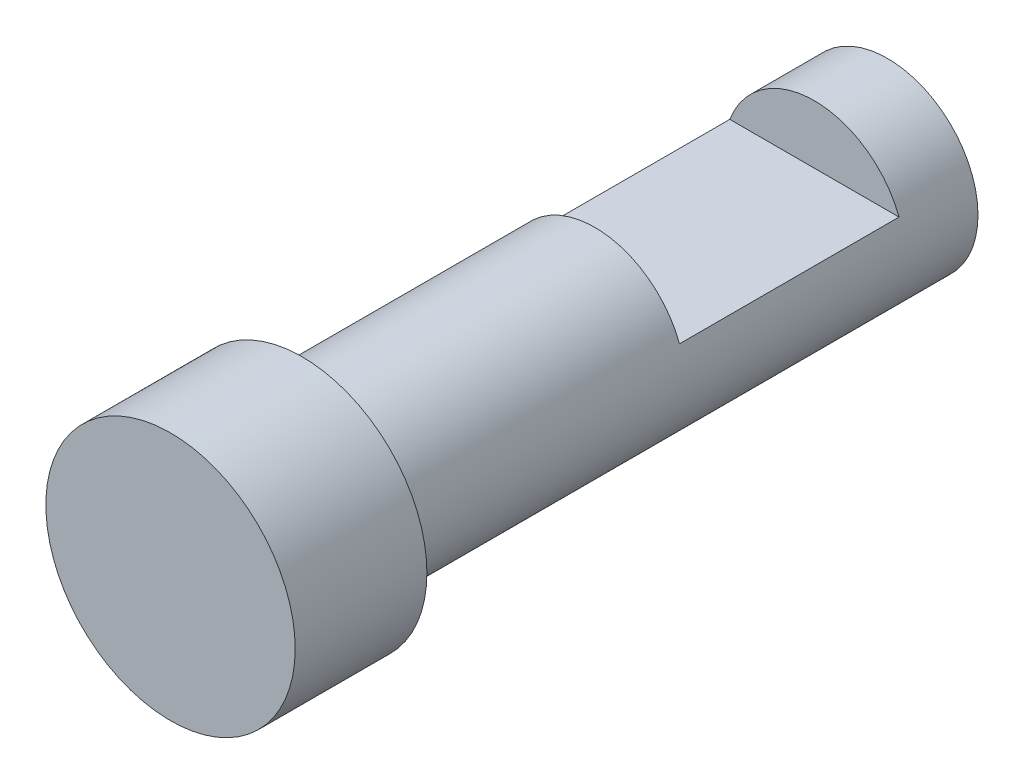
ISO-10303-21;
HEADER;
FILE_DESCRIPTION(('STEP AP214'),'2;1');
FILE_NAME('part.step','',(''),(''),'','','');
FILE_SCHEMA(('AUTOMOTIVE_DESIGN { 1 0 10303 214 1 1 1 1 }'));
ENDSEC;
DATA;
#1=APPLICATION_CONTEXT('core data for automotive mechanical design processes');
#2=APPLICATION_PROTOCOL_DEFINITION('international standard','automotive_design',2000,#1);
#3=PRODUCT_CONTEXT('',#1,'mechanical');
#4=PRODUCT('Part','Part','',(#3));
#5=PRODUCT_RELATED_PRODUCT_CATEGORY('part','',(#4));
#6=PRODUCT_DEFINITION_FORMATION('','',#4);
#7=PRODUCT_DEFINITION_CONTEXT('part definition',#1,'design');
#8=PRODUCT_DEFINITION('design','',#6,#7);
#9=PRODUCT_DEFINITION_SHAPE('','',#8);
#10=(LENGTH_UNIT() NAMED_UNIT(*) SI_UNIT(.MILLI.,.METRE.));
#11=(NAMED_UNIT(*) PLANE_ANGLE_UNIT() SI_UNIT($,.RADIAN.));
#12=(NAMED_UNIT(*) SI_UNIT($,.STERADIAN.) SOLID_ANGLE_UNIT());
#13=UNCERTAINTY_MEASURE_WITH_UNIT(LENGTH_MEASURE(1.E-05),#10,'distance_accuracy_value','');
#14=(GEOMETRIC_REPRESENTATION_CONTEXT(3) GLOBAL_UNCERTAINTY_ASSIGNED_CONTEXT((#13)) GLOBAL_UNIT_ASSIGNED_CONTEXT((#10,
#11,#12)) REPRESENTATION_CONTEXT('',''));
#15=CARTESIAN_POINT('',(0.,0.,0.));
#16=DIRECTION('',(0.,0.,1.));
#17=DIRECTION('',(1.,0.,0.));
#18=AXIS2_PLACEMENT_3D('',#15,#16,#17);
#19=CARTESIAN_POINT('',(0.,0.,0.));
#20=DIRECTION('',(0.,0.,1.));
#21=DIRECTION('',(1.,0.,0.));
#22=AXIS2_PLACEMENT_3D('',#19,#20,#21);
#23=PLANE('',#22);
#24=CARTESIAN_POINT('',(0.,0.,0.));
#25=DIRECTION('',(0.,0.,1.));
#26=DIRECTION('',(1.,0.,0.));
#27=AXIS2_PLACEMENT_3D('',#24,#25,#26);
#28=CIRCLE('',#27,5.4102);
#29=CARTESIAN_POINT('',(5.4102,0.,0.));
#30=VERTEX_POINT('',#29);
#31=EDGE_CURVE('E81',#30,#30,#28,.T.);
#32=ORIENTED_EDGE('',*,*,#31,.F.);
#33=EDGE_LOOP('',(#32));
#34=FACE_BOUND('',#33,.T.);
#35=CARTESIAN_POINT('',(0.,0.,0.));
#36=DIRECTION('',(0.,0.,1.));
#37=DIRECTION('',(1.,0.,0.));
#38=AXIS2_PLACEMENT_3D('',#35,#36,#37);
#39=CIRCLE('',#38,3.9243);
#40=CARTESIAN_POINT('',(3.9243,0.,0.));
#41=VERTEX_POINT('',#40);
#42=EDGE_CURVE('E75',#41,#41,#39,.F.);
#43=ORIENTED_EDGE('',*,*,#42,.F.);
#44=EDGE_LOOP('',(#43));
#45=FACE_BOUND('',#44,.T.);
#46=ADVANCED_FACE('F35',(#34,#45),#23,.F.);
#47=CARTESIAN_POINT('',(0.,0.,5.715));
#48=DIRECTION('',(0.,0.,-1.));
#49=DIRECTION('',(-1.,0.,0.));
#50=AXIS2_PLACEMENT_3D('',#47,#48,#49);
#51=CYLINDRICAL_SURFACE('',#50,5.4102);
#52=CARTESIAN_POINT('',(0.,0.,5.715));
#53=DIRECTION('',(0.,0.,1.));
#54=DIRECTION('',(1.,0.,0.));
#55=AXIS2_PLACEMENT_3D('',#52,#53,#54);
#56=CIRCLE('',#55,5.4102);
#57=CARTESIAN_POINT('',(5.4102,0.,5.715));
#58=VERTEX_POINT('',#57);
#59=EDGE_CURVE('E80',#58,#58,#56,.T.);
#60=ORIENTED_EDGE('',*,*,#59,.F.);
#61=EDGE_LOOP('',(#60));
#62=FACE_BOUND('',#61,.T.);
#63=ORIENTED_EDGE('',*,*,#31,.T.);
#64=EDGE_LOOP('',(#63));
#65=FACE_BOUND('',#64,.T.);
#66=ADVANCED_FACE('F37',(#62,#65),#51,.T.);
#67=CARTESIAN_POINT('',(0.,0.,5.715));
#68=DIRECTION('',(0.,0.,1.));
#69=DIRECTION('',(1.,0.,0.));
#70=AXIS2_PLACEMENT_3D('',#67,#68,#69);
#71=PLANE('',#70);
#72=ORIENTED_EDGE('',*,*,#59,.T.);
#73=EDGE_LOOP('',(#72));
#74=FACE_BOUND('',#73,.T.);
#75=ADVANCED_FACE('F93',(#74),#71,.T.);
#76=CARTESIAN_POINT('',(0.,0.,-25.4));
#77=DIRECTION('',(0.,0.,1.));
#78=DIRECTION('',(1.,0.,0.));
#79=AXIS2_PLACEMENT_3D('',#76,#77,#78);
#80=CYLINDRICAL_SURFACE('',#79,3.9243);
#81=DIRECTION('',(0.,0.,1.));
#82=VECTOR('',#81,1.);
#83=CARTESIAN_POINT('',(-3.67203540287944,1.3843,-25.4));
#84=LINE('',#83,#82);
#85=CARTESIAN_POINT('',(-3.67203540287944,1.3843,-22.225));
#86=VERTEX_POINT('',#85);
#87=CARTESIAN_POINT('',(-3.67203540287944,1.3843,-12.7));
#88=VERTEX_POINT('',#87);
#89=EDGE_CURVE('E11',#86,#88,#84,.T.);
#90=ORIENTED_EDGE('',*,*,#89,.F.);
#91=CARTESIAN_POINT('',(0.,0.,-22.225));
#92=DIRECTION('',(0.,0.,-1.));
#93=DIRECTION('',(-1.,0.,0.));
#94=AXIS2_PLACEMENT_3D('',#91,#92,#93);
#95=CIRCLE('',#94,3.9243);
#96=CARTESIAN_POINT('',(3.67203540287944,1.3843,-22.225));
#97=VERTEX_POINT('',#96);
#98=EDGE_CURVE('E67',#86,#97,#95,.T.);
#99=ORIENTED_EDGE('',*,*,#98,.T.);
#100=DIRECTION('',(0.,0.,1.));
#101=VECTOR('',#100,1.);
#102=CARTESIAN_POINT('',(3.67203540287944,1.3843,-25.4));
#103=LINE('',#102,#101);
#104=CARTESIAN_POINT('',(3.67203540287944,1.3843,-12.7));
#105=VERTEX_POINT('',#104);
#106=EDGE_CURVE('E43',#105,#97,#103,.F.);
#107=ORIENTED_EDGE('',*,*,#106,.F.);
#108=CARTESIAN_POINT('',(0.,0.,-12.7));
#109=DIRECTION('',(0.,0.,1.));
#110=DIRECTION('',(1.,0.,0.));
#111=AXIS2_PLACEMENT_3D('',#108,#109,#110);
#112=CIRCLE('',#111,3.9243);
#113=EDGE_CURVE('E49',#105,#88,#112,.T.);
#114=ORIENTED_EDGE('',*,*,#113,.T.);
#115=EDGE_LOOP('',(#90,#99,#107,#114));
#116=FACE_BOUND('',#115,.T.);
#117=CARTESIAN_POINT('',(0.,0.,-25.4));
#118=DIRECTION('',(0.,0.,-1.));
#119=DIRECTION('',(-1.,0.,0.));
#120=AXIS2_PLACEMENT_3D('',#117,#118,#119);
#121=CIRCLE('',#120,3.9243);
#122=CARTESIAN_POINT('',(-3.9243,0.,-25.4));
#123=VERTEX_POINT('',#122);
#124=EDGE_CURVE('E70',#123,#123,#121,.T.);
#125=ORIENTED_EDGE('',*,*,#124,.F.);
#126=EDGE_LOOP('',(#125));
#127=FACE_BOUND('',#126,.T.);
#128=ORIENTED_EDGE('',*,*,#42,.T.);
#129=EDGE_LOOP('',(#128));
#130=FACE_BOUND('',#129,.T.);
#131=ADVANCED_FACE('F72',(#116,#127,#130),#80,.T.);
#132=CARTESIAN_POINT('',(0.,0.,-25.4));
#133=DIRECTION('',(0.,0.,-1.));
#134=DIRECTION('',(-1.,0.,0.));
#135=AXIS2_PLACEMENT_3D('',#132,#133,#134);
#136=PLANE('',#135);
#137=ORIENTED_EDGE('',*,*,#124,.T.);
#138=EDGE_LOOP('',(#137));
#139=FACE_BOUND('',#138,.T.);
#140=ADVANCED_FACE('F90',(#139),#136,.T.);
#141=CARTESIAN_POINT('',(-4.78219373025013,1.3843,-22.225));
#142=DIRECTION('',(0.,0.,-1.));
#143=DIRECTION('',(-1.,0.,0.));
#144=AXIS2_PLACEMENT_3D('',#141,#142,#143);
#145=PLANE('',#144);
#146=DIRECTION('',(-1.,0.,0.));
#147=VECTOR('',#146,1.);
#148=CARTESIAN_POINT('',(-4.78219373025013,1.3843,-22.225));
#149=LINE('',#148,#147);
#150=EDGE_CURVE('E63',#97,#86,#149,.T.);
#151=ORIENTED_EDGE('',*,*,#150,.F.);
#152=ORIENTED_EDGE('',*,*,#98,.F.);
#153=EDGE_LOOP('',(#151,#152));
#154=FACE_BOUND('',#153,.T.);
#155=ADVANCED_FACE('F69',(#154),#145,.F.);
#156=CARTESIAN_POINT('',(-4.78219373025012,1.3843,-12.7));
#157=DIRECTION('',(0.,0.,1.));
#158=DIRECTION('',(1.,0.,0.));
#159=AXIS2_PLACEMENT_3D('',#156,#157,#158);
#160=PLANE('',#159);
#161=DIRECTION('',(1.,0.,0.));
#162=VECTOR('',#161,1.);
#163=CARTESIAN_POINT('',(-4.78219373025012,1.3843,-12.7));
#164=LINE('',#163,#162);
#165=EDGE_CURVE('E64',#88,#105,#164,.T.);
#166=ORIENTED_EDGE('',*,*,#165,.F.);
#167=ORIENTED_EDGE('',*,*,#113,.F.);
#168=EDGE_LOOP('',(#166,#167));
#169=FACE_BOUND('',#168,.T.);
#170=ADVANCED_FACE('F110',(#169),#160,.F.);
#171=CARTESIAN_POINT('',(0.,1.3843,0.));
#172=DIRECTION('',(0.,1.,0.));
#173=DIRECTION('',(0.,0.,1.));
#174=AXIS2_PLACEMENT_3D('',#171,#172,#173);
#175=PLANE('',#174);
#176=ORIENTED_EDGE('',*,*,#89,.T.);
#177=ORIENTED_EDGE('',*,*,#165,.T.);
#178=ORIENTED_EDGE('',*,*,#106,.T.);
#179=ORIENTED_EDGE('',*,*,#150,.T.);
#180=EDGE_LOOP('',(#176,#177,#178,#179));
#181=FACE_BOUND('',#180,.T.);
#182=ADVANCED_FACE('F62',(#181),#175,.T.);
#183=CLOSED_SHELL('',(#46,#66,#75,#131,#140,#155,#170,#182));
#184=MANIFOLD_SOLID_BREP('B2',#183);
#185=ADVANCED_BREP_SHAPE_REPRESENTATION('',(#18,#184),#14);
#186=SHAPE_DEFINITION_REPRESENTATION(#9,#185);
ENDSEC;
END-ISO-10303-21;
